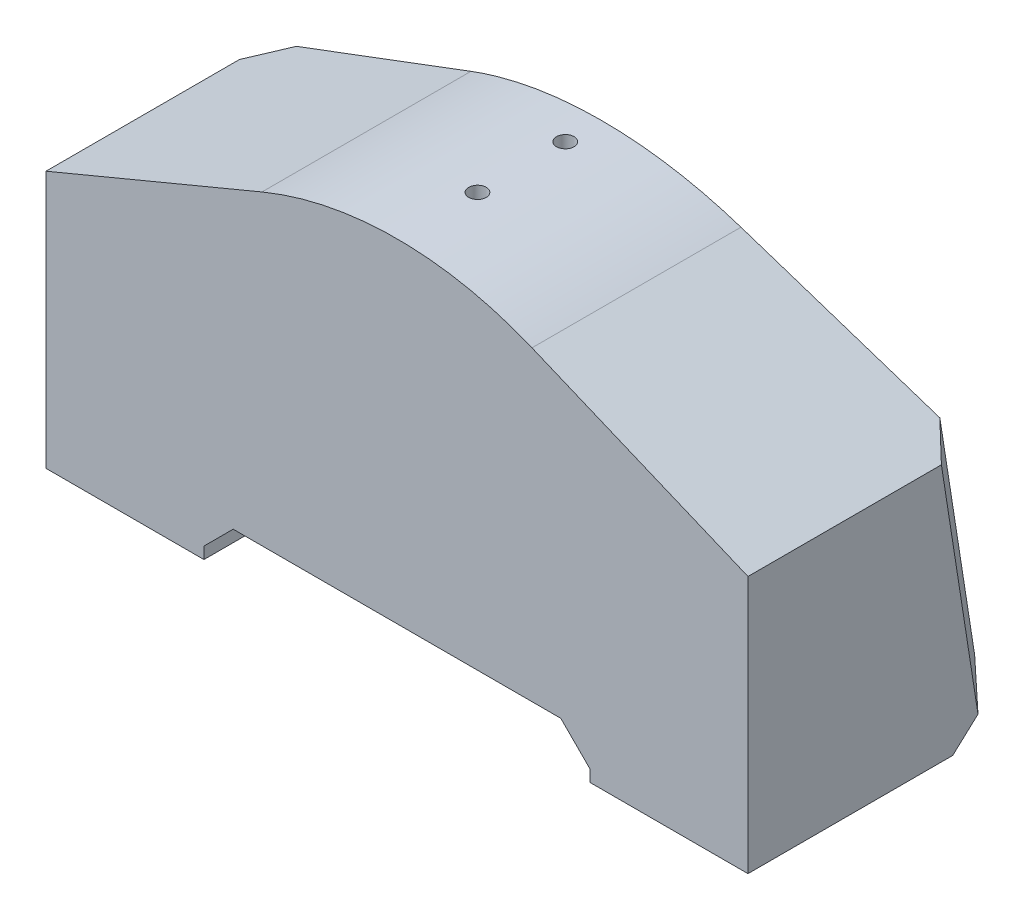
ISO-10303-21;
HEADER;
FILE_DESCRIPTION(('STEP AP214'),'2;1');
FILE_NAME('part.step','',(''),(''),'','','');
FILE_SCHEMA(('AUTOMOTIVE_DESIGN { 1 0 10303 214 1 1 1 1 }'));
ENDSEC;
DATA;
#1=APPLICATION_CONTEXT('core data for automotive mechanical design processes');
#2=APPLICATION_PROTOCOL_DEFINITION('international standard','automotive_design',2000,#1);
#3=PRODUCT_CONTEXT('',#1,'mechanical');
#4=PRODUCT('Part','Part','',(#3));
#5=PRODUCT_RELATED_PRODUCT_CATEGORY('part','',(#4));
#6=PRODUCT_DEFINITION_FORMATION('','',#4);
#7=PRODUCT_DEFINITION_CONTEXT('part definition',#1,'design');
#8=PRODUCT_DEFINITION('design','',#6,#7);
#9=PRODUCT_DEFINITION_SHAPE('','',#8);
#10=(LENGTH_UNIT() NAMED_UNIT(*) SI_UNIT(.MILLI.,.METRE.));
#11=(NAMED_UNIT(*) PLANE_ANGLE_UNIT() SI_UNIT($,.RADIAN.));
#12=(NAMED_UNIT(*) SI_UNIT($,.STERADIAN.) SOLID_ANGLE_UNIT());
#13=UNCERTAINTY_MEASURE_WITH_UNIT(LENGTH_MEASURE(1.E-05),#10,'distance_accuracy_value','');
#14=(GEOMETRIC_REPRESENTATION_CONTEXT(3) GLOBAL_UNCERTAINTY_ASSIGNED_CONTEXT((#13)) GLOBAL_UNIT_ASSIGNED_CONTEXT((#10,
#11,#12)) REPRESENTATION_CONTEXT('',''));
#15=CARTESIAN_POINT('',(0.,0.,0.));
#16=DIRECTION('',(0.,0.,1.));
#17=DIRECTION('',(1.,0.,0.));
#18=AXIS2_PLACEMENT_3D('',#15,#16,#17);
#19=CARTESIAN_POINT('',(0.,-14.,0.));
#20=DIRECTION('',(0.,-1.,0.));
#21=DIRECTION('',(0.,0.,-1.));
#22=AXIS2_PLACEMENT_3D('',#19,#20,#21);
#23=PLANE('',#22);
#24=CARTESIAN_POINT('',(-50.,-14.,-7.5));
#25=DIRECTION('',(0.,-1.,0.));
#26=DIRECTION('',(0.,0.,-1.));
#27=AXIS2_PLACEMENT_3D('',#24,#25,#26);
#28=CIRCLE('',#27,1.55);
#29=CARTESIAN_POINT('',(-50.,-14.,-9.05));
#30=VERTEX_POINT('',#29);
#31=EDGE_CURVE('E317',#30,#30,#28,.T.);
#32=ORIENTED_EDGE('',*,*,#31,.F.);
#33=EDGE_LOOP('',(#32));
#34=FACE_BOUND('',#33,.T.);
#35=DIRECTION('',(0.,0.,1.));
#36=VECTOR('',#35,1.);
#37=CARTESIAN_POINT('',(-60.,-14.,22.5));
#38=LINE('',#37,#36);
#39=CARTESIAN_POINT('',(-60.,-14.,-12.5));
#40=VERTEX_POINT('',#39);
#41=CARTESIAN_POINT('',(-60.,-14.,22.5));
#42=VERTEX_POINT('',#41);
#43=EDGE_CURVE('E175',#40,#42,#38,.T.);
#44=ORIENTED_EDGE('',*,*,#43,.F.);
#45=DIRECTION('',(-1.,0.,0.));
#46=VECTOR('',#45,1.);
#47=CARTESIAN_POINT('',(60.,-14.,-12.5));
#48=LINE('',#47,#46);
#49=CARTESIAN_POINT('',(-33.,-14.,-12.5));
#50=VERTEX_POINT('',#49);
#51=EDGE_CURVE('E169',#50,#40,#48,.T.);
#52=ORIENTED_EDGE('',*,*,#51,.F.);
#53=DIRECTION('',(0.,0.,1.));
#54=VECTOR('',#53,1.);
#55=CARTESIAN_POINT('',(-33.,-14.,-22.5));
#56=LINE('',#55,#54);
#57=CARTESIAN_POINT('',(-33.,-14.,22.5));
#58=VERTEX_POINT('',#57);
#59=EDGE_CURVE('E357',#50,#58,#56,.T.);
#60=ORIENTED_EDGE('',*,*,#59,.T.);
#61=DIRECTION('',(1.,0.,0.));
#62=VECTOR('',#61,1.);
#63=CARTESIAN_POINT('',(-60.,-14.,22.5));
#64=LINE('',#63,#62);
#65=EDGE_CURVE('E184',#42,#58,#64,.T.);
#66=ORIENTED_EDGE('',*,*,#65,.F.);
#67=EDGE_LOOP('',(#44,#52,#60,#66));
#68=FACE_BOUND('',#67,.T.);
#69=ADVANCED_FACE('F36',(#34,#68),#23,.T.);
#70=CARTESIAN_POINT('',(60.,3.09818876341525,-19.8284079932371));
#71=DIRECTION('',(0.,-0.154376880977534,0.988012033641113));
#72=DIRECTION('',(0.,-0.988012033641113,-0.154376880977534));
#73=AXIS2_PLACEMENT_3D('',#70,#71,#72);
#74=PLANE('',#73);
#75=DIRECTION('',(-1.,0.,0.));
#76=VECTOR('',#75,1.);
#77=CARTESIAN_POINT('',(60.,-6.,-21.2499999941611));
#78=LINE('',#77,#76);
#79=CARTESIAN_POINT('',(55.,-6.,-21.2499999941611));
#80=VERTEX_POINT('',#79);
#81=CARTESIAN_POINT('',(-55.,-6.,-21.2499999941611));
#82=VERTEX_POINT('',#81);
#83=EDGE_CURVE('E159',#80,#82,#78,.T.);
#84=ORIENTED_EDGE('',*,*,#83,.T.);
#85=DIRECTION('',(0.,0.988012033641113,0.154376880977534));
#86=VECTOR('',#85,1.);
#87=CARTESIAN_POINT('',(-55.,3.09818876341525,-19.8284079932371));
#88=LINE('',#87,#86);
#89=CARTESIAN_POINT('',(-55.,32.0833332894768,-15.2994791398849));
#90=VERTEX_POINT('',#89);
#91=EDGE_CURVE('E203',#82,#90,#88,.T.);
#92=ORIENTED_EDGE('',*,*,#91,.T.);
#93=DIRECTION('',(0.921414559252609,0.383922724939917,0.0599879260520718));
#94=VECTOR('',#93,1.);
#95=CARTESIAN_POINT('',(-60.3800070223258,29.8416637440307,-15.6497400079969));
#96=LINE('',#95,#94);
#97=CARTESIAN_POINT('',(-23.076922961942,45.3846151086608,-13.2211538459293));
#98=VERTEX_POINT('',#97);
#99=EDGE_CURVE('E314',#90,#98,#96,.T.);
#100=ORIENTED_EDGE('',*,*,#99,.T.);
#101=CARTESIAN_POINT('',(0.,-10.,-21.8749999970806));
#102=DIRECTION('',(0.,-0.154376880977534,0.988012033641113));
#103=DIRECTION('',(0.,0.988012033641113,0.154376880977534));
#104=AXIS2_PLACEMENT_3D('',#101,#102,#103);
#105=ELLIPSE('',#104,60.7280049818135,59.9999997010492);
#106=CARTESIAN_POINT('',(23.076922961942,45.3846151086608,-13.2211538459293));
#107=VERTEX_POINT('',#106);
#108=EDGE_CURVE('E319',#98,#107,#105,.F.);
#109=ORIENTED_EDGE('',*,*,#108,.T.);
#110=DIRECTION('',(0.921414559252609,-0.383922724939917,-0.0599879260520719));
#111=VECTOR('',#110,1.);
#112=CARTESIAN_POINT('',(60.3800070223258,29.8416637440307,-15.6497400079969));
#113=LINE('',#112,#111);
#114=CARTESIAN_POINT('',(55.,32.0833332894768,-15.2994791398849));
#115=VERTEX_POINT('',#114);
#116=EDGE_CURVE('E196',#107,#115,#113,.T.);
#117=ORIENTED_EDGE('',*,*,#116,.T.);
#118=DIRECTION('',(0.,-0.988012033641113,-0.154376880977534));
#119=VECTOR('',#118,1.);
#120=CARTESIAN_POINT('',(55.,3.09818876341525,-19.8284079932371));
#121=LINE('',#120,#119);
#122=EDGE_CURVE('E205',#115,#80,#121,.T.);
#123=ORIENTED_EDGE('',*,*,#122,.T.);
#124=EDGE_LOOP('',(#84,#92,#100,#109,#117,#123));
#125=FACE_BOUND('',#124,.T.);
#126=ADVANCED_FACE('F259',(#125),#74,.F.);
#127=CARTESIAN_POINT('',(60.,30.,22.5));
#128=DIRECTION('',(-1.,0.,0.));
#129=DIRECTION('',(0.,0.,1.));
#130=AXIS2_PLACEMENT_3D('',#127,#128,#129);
#131=PLANE('',#130);
#132=DIRECTION('',(0.,-0.674769199790194,0.738028811778037));
#133=VECTOR('',#132,1.);
#134=CARTESIAN_POINT('',(60.,-6.,-21.2499999941611));
#135=LINE('',#134,#133);
#136=CARTESIAN_POINT('',(60.,-10.0485336856261,-16.8219162784624));
#137=VERTEX_POINT('',#136);
#138=CARTESIAN_POINT('',(60.,-14.,-12.5));
#139=VERTEX_POINT('',#138);
#140=EDGE_CURVE('E149',#137,#139,#135,.T.);
#141=ORIENTED_EDGE('',*,*,#140,.F.);
#142=DIRECTION('',(0.,0.988012033641113,0.154376880977534));
#143=VECTOR('',#142,1.);
#144=CARTESIAN_POINT('',(60.,35.0431775798572,-9.77633636032003));
#145=LINE('',#144,#143);
#146=CARTESIAN_POINT('',(60.,30.,-10.5643328608535));
#147=VERTEX_POINT('',#146);
#148=EDGE_CURVE('E199',#137,#147,#145,.T.);
#149=ORIENTED_EDGE('',*,*,#148,.T.);
#150=DIRECTION('',(0.,0.,-1.));
#151=VECTOR('',#150,1.);
#152=CARTESIAN_POINT('',(60.,30.,22.5));
#153=LINE('',#152,#151);
#154=CARTESIAN_POINT('',(60.,30.,22.5));
#155=VERTEX_POINT('',#154);
#156=EDGE_CURVE('E187',#155,#147,#153,.T.);
#157=ORIENTED_EDGE('',*,*,#156,.F.);
#158=DIRECTION('',(0.,-1.,0.));
#159=VECTOR('',#158,1.);
#160=CARTESIAN_POINT('',(60.,30.,22.5));
#161=LINE('',#160,#159);
#162=CARTESIAN_POINT('',(60.,-14.,22.5));
#163=VERTEX_POINT('',#162);
#164=EDGE_CURVE('E174',#155,#163,#161,.T.);
#165=ORIENTED_EDGE('',*,*,#164,.T.);
#166=DIRECTION('',(0.,0.,-1.));
#167=VECTOR('',#166,1.);
#168=CARTESIAN_POINT('',(60.,-14.,22.5));
#169=LINE('',#168,#167);
#170=EDGE_CURVE('E167',#163,#139,#169,.T.);
#171=ORIENTED_EDGE('',*,*,#170,.T.);
#172=EDGE_LOOP('',(#141,#149,#157,#165,#171));
#173=FACE_BOUND('',#172,.T.);
#174=ADVANCED_FACE('F172',(#173),#131,.F.);
#175=CARTESIAN_POINT('',(-60.,30.,22.5));
#176=DIRECTION('',(1.,0.,0.));
#177=DIRECTION('',(0.,0.,-1.));
#178=AXIS2_PLACEMENT_3D('',#175,#176,#177);
#179=PLANE('',#178);
#180=DIRECTION('',(0.,-0.674769199790194,0.738028811778037));
#181=VECTOR('',#180,1.);
#182=CARTESIAN_POINT('',(-60.,-6.,-21.2499999941611));
#183=LINE('',#182,#181);
#184=CARTESIAN_POINT('',(-60.,-10.0485336856261,-16.8219162784624));
#185=VERTEX_POINT('',#184);
#186=EDGE_CURVE('E160',#185,#40,#183,.T.);
#187=ORIENTED_EDGE('',*,*,#186,.T.);
#188=ORIENTED_EDGE('',*,*,#43,.T.);
#189=DIRECTION('',(0.,-1.,0.));
#190=VECTOR('',#189,1.);
#191=CARTESIAN_POINT('',(-60.,30.,22.5));
#192=LINE('',#191,#190);
#193=CARTESIAN_POINT('',(-60.,30.,22.5));
#194=VERTEX_POINT('',#193);
#195=EDGE_CURVE('E193',#194,#42,#192,.T.);
#196=ORIENTED_EDGE('',*,*,#195,.F.);
#197=DIRECTION('',(0.,0.,1.));
#198=VECTOR('',#197,1.);
#199=CARTESIAN_POINT('',(-60.,30.,22.5));
#200=LINE('',#199,#198);
#201=CARTESIAN_POINT('',(-60.,30.,-10.5643328608535));
#202=VERTEX_POINT('',#201);
#203=EDGE_CURVE('E190',#202,#194,#200,.T.);
#204=ORIENTED_EDGE('',*,*,#203,.F.);
#205=DIRECTION('',(0.,-0.988012033641113,-0.154376880977534));
#206=VECTOR('',#205,1.);
#207=CARTESIAN_POINT('',(-60.,35.0431775798572,-9.77633636032003));
#208=LINE('',#207,#206);
#209=EDGE_CURVE('E210',#202,#185,#208,.T.);
#210=ORIENTED_EDGE('',*,*,#209,.T.);
#211=EDGE_LOOP('',(#187,#188,#196,#204,#210));
#212=FACE_BOUND('',#211,.T.);
#213=ADVANCED_FACE('F299',(#212),#179,.F.);
#214=CARTESIAN_POINT('',(50.,-14.,-7.5));
#215=DIRECTION('',(0.,-1.,0.));
#216=DIRECTION('',(0.,0.,-1.));
#217=AXIS2_PLACEMENT_3D('',#214,#215,#216);
#218=CIRCLE('',#217,1.55);
#219=CARTESIAN_POINT('',(50.,-14.,-9.05));
#220=VERTEX_POINT('',#219);
#221=EDGE_CURVE('E311',#220,#220,#218,.T.);
#222=ORIENTED_EDGE('',*,*,#221,.F.);
#223=EDGE_LOOP('',(#222));
#224=FACE_BOUND('',#223,.T.);
#225=DIRECTION('',(0.,0.,1.));
#226=VECTOR('',#225,1.);
#227=CARTESIAN_POINT('',(33.,-14.,-22.5));
#228=LINE('',#227,#226);
#229=CARTESIAN_POINT('',(33.,-14.,-12.5));
#230=VERTEX_POINT('',#229);
#231=CARTESIAN_POINT('',(33.,-14.,22.5));
#232=VERTEX_POINT('',#231);
#233=EDGE_CURVE('E168',#230,#232,#228,.T.);
#234=ORIENTED_EDGE('',*,*,#233,.F.);
#235=EDGE_CURVE('E152',#139,#230,#48,.T.);
#236=ORIENTED_EDGE('',*,*,#235,.F.);
#237=ORIENTED_EDGE('',*,*,#170,.F.);
#238=EDGE_CURVE('E178',#232,#163,#64,.T.);
#239=ORIENTED_EDGE('',*,*,#238,.F.);
#240=EDGE_LOOP('',(#234,#236,#237,#239));
#241=FACE_BOUND('',#240,.T.);
#242=ADVANCED_FACE('F165',(#224,#241),#23,.T.);
#243=CARTESIAN_POINT('',(60.,35.0431775798572,-9.77633636032003));
#244=DIRECTION('',(-0.707106781186546,-0.109160939397643,0.698630008881544));
#245=DIRECTION('',(0.,0.988012033641113,0.154376880977534));
#246=AXIS2_PLACEMENT_3D('',#243,#244,#245);
#247=PLANE('',#246);
#248=ORIENTED_EDGE('',*,*,#148,.F.);
#249=DIRECTION('',(0.64019200646645,-0.518367780689595,0.566964759750908));
#250=VECTOR('',#249,1.);
#251=CARTESIAN_POINT('',(47.5934023585105,-0.00282799051019855,-27.8094068751635));
#252=LINE('',#251,#250);
#253=EDGE_CURVE('E155',#137,#80,#252,.F.);
#254=ORIENTED_EDGE('',*,*,#253,.T.);
#255=ORIENTED_EDGE('',*,*,#122,.F.);
#256=DIRECTION('',(0.694968228270403,-0.289570089016893,0.658155244027916));
#257=VECTOR('',#256,1.);
#258=CARTESIAN_POINT('',(54.5406618500906,32.2747241812434,-15.734485806157));
#259=LINE('',#258,#257);
#260=EDGE_CURVE('E201',#147,#115,#259,.F.);
#261=ORIENTED_EDGE('',*,*,#260,.F.);
#262=EDGE_LOOP('',(#248,#254,#255,#261));
#263=FACE_BOUND('',#262,.T.);
#264=ADVANCED_FACE('F298',(#263),#247,.F.);
#265=CARTESIAN_POINT('',(-55.,3.09818876341525,-19.8284079932371));
#266=DIRECTION('',(0.707106781186549,-0.109160939397643,0.698630008881541));
#267=DIRECTION('',(0.,0.988012033641113,0.154376880977534));
#268=AXIS2_PLACEMENT_3D('',#265,#266,#267);
#269=PLANE('',#268);
#270=ORIENTED_EDGE('',*,*,#91,.F.);
#271=DIRECTION('',(0.640192006466447,0.518367780689597,-0.56696475975091));
#272=VECTOR('',#271,1.);
#273=CARTESIAN_POINT('',(-52.4967113891635,-3.97307034683681,-23.466954300829));
#274=LINE('',#273,#272);
#275=EDGE_CURVE('E352',#82,#185,#274,.F.);
#276=ORIENTED_EDGE('',*,*,#275,.T.);
#277=ORIENTED_EDGE('',*,*,#209,.F.);
#278=DIRECTION('',(0.6949682282704,0.289570089016892,-0.658155244027919));
#279=VECTOR('',#278,1.);
#280=CARTESIAN_POINT('',(-54.5406618500906,32.2747241812434,-15.734485806157));
#281=LINE('',#280,#279);
#282=EDGE_CURVE('E208',#90,#202,#281,.F.);
#283=ORIENTED_EDGE('',*,*,#282,.F.);
#284=EDGE_LOOP('',(#270,#276,#277,#283));
#285=FACE_BOUND('',#284,.T.);
#286=ADVANCED_FACE('F250',(#285),#269,.F.);
#287=CARTESIAN_POINT('',(-33.,-14.,-22.5));
#288=DIRECTION('',(1.,0.,0.));
#289=DIRECTION('',(0.,0.,-1.));
#290=AXIS2_PLACEMENT_3D('',#287,#288,#289);
#291=PLANE('',#290);
#292=ORIENTED_EDGE('',*,*,#59,.F.);
#293=DIRECTION('',(0.,0.674769199790194,-0.738028811778037));
#294=VECTOR('',#293,1.);
#295=CARTESIAN_POINT('',(-33.,-9.02000889254427,-17.946865270145));
#296=LINE('',#295,#294);
#297=CARTESIAN_POINT('',(-33.,-12.,-14.6874999985402));
#298=VERTEX_POINT('',#297);
#299=EDGE_CURVE('E381',#50,#298,#296,.T.);
#300=ORIENTED_EDGE('',*,*,#299,.T.);
#301=DIRECTION('',(0.,0.,1.));
#302=VECTOR('',#301,1.);
#303=CARTESIAN_POINT('',(-33.,-12.,22.5));
#304=LINE('',#303,#302);
#305=CARTESIAN_POINT('',(-33.,-12.,22.5));
#306=VERTEX_POINT('',#305);
#307=EDGE_CURVE('E65',#298,#306,#304,.T.);
#308=ORIENTED_EDGE('',*,*,#307,.T.);
#309=DIRECTION('',(0.,1.,0.));
#310=VECTOR('',#309,1.);
#311=CARTESIAN_POINT('',(-33.,-14.,22.5));
#312=LINE('',#311,#310);
#313=EDGE_CURVE('E350',#58,#306,#312,.T.);
#314=ORIENTED_EDGE('',*,*,#313,.F.);
#315=EDGE_LOOP('',(#292,#300,#308,#314));
#316=FACE_BOUND('',#315,.T.);
#317=ADVANCED_FACE('F246',(#316),#291,.T.);
#318=CARTESIAN_POINT('',(-33.,-7.,-22.5));
#319=DIRECTION('',(0.,-1.,0.));
#320=DIRECTION('',(0.,0.,-1.));
#321=AXIS2_PLACEMENT_3D('',#318,#319,#320);
#322=PLANE('',#321);
#323=CARTESIAN_POINT('',(0.,-7.,8.75000000583888));
#324=DIRECTION('',(0.,-1.,0.));
#325=DIRECTION('',(0.,0.,-1.));
#326=AXIS2_PLACEMENT_3D('',#323,#324,#325);
#327=CIRCLE('',#326,1.5);
#328=CARTESIAN_POINT('',(0.,-7.,7.25000000583888));
#329=VERTEX_POINT('',#328);
#330=EDGE_CURVE('E391',#329,#329,#327,.T.);
#331=ORIENTED_EDGE('',*,*,#330,.F.);
#332=EDGE_LOOP('',(#331));
#333=FACE_BOUND('',#332,.T.);
#334=CARTESIAN_POINT('',(0.,-7.,-6.24999999416112));
#335=DIRECTION('',(0.,-1.,0.));
#336=DIRECTION('',(0.,0.,-1.));
#337=AXIS2_PLACEMENT_3D('',#334,#335,#336);
#338=CIRCLE('',#337,1.5);
#339=CARTESIAN_POINT('',(0.,-7.,-7.74999999416112));
#340=VERTEX_POINT('',#339);
#341=EDGE_CURVE('E394',#340,#340,#338,.T.);
#342=ORIENTED_EDGE('',*,*,#341,.F.);
#343=EDGE_LOOP('',(#342));
#344=FACE_BOUND('',#343,.T.);
#345=DIRECTION('',(0.,0.,-1.));
#346=VECTOR('',#345,1.);
#347=CARTESIAN_POINT('',(-28.,-7.,-21.406249994891));
#348=LINE('',#347,#346);
#349=CARTESIAN_POINT('',(-28.,-7.,22.5));
#350=VERTEX_POINT('',#349);
#351=CARTESIAN_POINT('',(-28.,-7.,-20.156249994891));
#352=VERTEX_POINT('',#351);
#353=EDGE_CURVE('E213',#350,#352,#348,.T.);
#354=ORIENTED_EDGE('',*,*,#353,.T.);
#355=DIRECTION('',(1.,0.,0.));
#356=VECTOR('',#355,1.);
#357=CARTESIAN_POINT('',(-33.,-7.,-20.156249994891));
#358=LINE('',#357,#356);
#359=CARTESIAN_POINT('',(28.,-7.,-20.156249994891));
#360=VERTEX_POINT('',#359);
#361=EDGE_CURVE('E57',#352,#360,#358,.T.);
#362=ORIENTED_EDGE('',*,*,#361,.T.);
#363=DIRECTION('',(0.,0.,1.));
#364=VECTOR('',#363,1.);
#365=CARTESIAN_POINT('',(28.,-7.,-22.5));
#366=LINE('',#365,#364);
#367=CARTESIAN_POINT('',(28.,-7.,22.5));
#368=VERTEX_POINT('',#367);
#369=EDGE_CURVE('E216',#360,#368,#366,.T.);
#370=ORIENTED_EDGE('',*,*,#369,.T.);
#371=DIRECTION('',(1.,0.,0.));
#372=VECTOR('',#371,1.);
#373=CARTESIAN_POINT('',(-33.,-7.,22.5));
#374=LINE('',#373,#372);
#375=EDGE_CURVE('E348',#350,#368,#374,.T.);
#376=ORIENTED_EDGE('',*,*,#375,.F.);
#377=EDGE_LOOP('',(#354,#362,#370,#376));
#378=FACE_BOUND('',#377,.T.);
#379=ADVANCED_FACE('F249',(#333,#344,#378),#322,.T.);
#380=CARTESIAN_POINT('',(33.,-14.,-22.5));
#381=DIRECTION('',(1.,0.,0.));
#382=DIRECTION('',(0.,0.,-1.));
#383=AXIS2_PLACEMENT_3D('',#380,#381,#382);
#384=PLANE('',#383);
#385=DIRECTION('',(0.,0.674769199790194,-0.738028811778037));
#386=VECTOR('',#385,1.);
#387=CARTESIAN_POINT('',(33.,-9.02000889254427,-17.946865270145));
#388=LINE('',#387,#386);
#389=CARTESIAN_POINT('',(33.,-12.,-14.6874999985403));
#390=VERTEX_POINT('',#389);
#391=EDGE_CURVE('E384',#230,#390,#388,.T.);
#392=ORIENTED_EDGE('',*,*,#391,.F.);
#393=ORIENTED_EDGE('',*,*,#233,.T.);
#394=DIRECTION('',(0.,1.,0.));
#395=VECTOR('',#394,1.);
#396=CARTESIAN_POINT('',(33.,-14.,22.5));
#397=LINE('',#396,#395);
#398=CARTESIAN_POINT('',(33.,-12.,22.5));
#399=VERTEX_POINT('',#398);
#400=EDGE_CURVE('E344',#232,#399,#397,.T.);
#401=ORIENTED_EDGE('',*,*,#400,.T.);
#402=DIRECTION('',(0.,0.,-1.));
#403=VECTOR('',#402,1.);
#404=CARTESIAN_POINT('',(33.,-12.,-22.5));
#405=LINE('',#404,#403);
#406=EDGE_CURVE('E218',#399,#390,#405,.T.);
#407=ORIENTED_EDGE('',*,*,#406,.T.);
#408=EDGE_LOOP('',(#392,#393,#401,#407));
#409=FACE_BOUND('',#408,.T.);
#410=ADVANCED_FACE('F253',(#409),#384,.F.);
#411=CARTESIAN_POINT('',(28.,-7.,-22.5));
#412=DIRECTION('',(0.707106781186543,0.707106781186552,0.));
#413=DIRECTION('',(0.,0.,1.));
#414=AXIS2_PLACEMENT_3D('',#411,#412,#413);
#415=PLANE('',#414);
#416=DIRECTION('',(-0.559341413757068,0.559341413757061,-0.611779670888545));
#417=VECTOR('',#416,1.);
#418=CARTESIAN_POINT('',(27.1979834997611,-6.19798349976119,-21.0334555414418));
#419=LINE('',#418,#417);
#420=EDGE_CURVE('E382',#390,#360,#419,.T.);
#421=ORIENTED_EDGE('',*,*,#420,.F.);
#422=ORIENTED_EDGE('',*,*,#406,.F.);
#423=DIRECTION('',(0.707106781186552,-0.707106781186543,0.));
#424=VECTOR('',#423,1.);
#425=CARTESIAN_POINT('',(-34.5000000000005,55.4999999999998,22.5));
#426=LINE('',#425,#424);
#427=EDGE_CURVE('E222',#368,#399,#426,.T.);
#428=ORIENTED_EDGE('',*,*,#427,.F.);
#429=ORIENTED_EDGE('',*,*,#369,.F.);
#430=EDGE_LOOP('',(#421,#422,#428,#429));
#431=FACE_BOUND('',#430,.T.);
#432=ADVANCED_FACE('F257',(#431),#415,.F.);
#433=CARTESIAN_POINT('',(-33.,-12.,-22.5));
#434=DIRECTION('',(0.70710678118655,-0.707106781186545,0.));
#435=DIRECTION('',(0.,0.,-1.));
#436=AXIS2_PLACEMENT_3D('',#433,#434,#435);
#437=PLANE('',#436);
#438=DIRECTION('',(0.559341413757061,0.559341413757065,-0.611779670888548));
#439=VECTOR('',#438,1.);
#440=CARTESIAN_POINT('',(-30.3266116711987,-9.32661167119871,-17.6115184812155));
#441=LINE('',#440,#439);
#442=EDGE_CURVE('E226',#352,#298,#441,.F.);
#443=ORIENTED_EDGE('',*,*,#442,.F.);
#444=ORIENTED_EDGE('',*,*,#353,.F.);
#445=DIRECTION('',(-0.707106781186545,-0.70710678118655,0.));
#446=VECTOR('',#445,1.);
#447=CARTESIAN_POINT('',(-25.4999999999999,-4.49999999999985,22.5));
#448=LINE('',#447,#446);
#449=EDGE_CURVE('E224',#306,#350,#448,.F.);
#450=ORIENTED_EDGE('',*,*,#449,.F.);
#451=ORIENTED_EDGE('',*,*,#307,.F.);
#452=EDGE_LOOP('',(#443,#444,#450,#451));
#453=FACE_BOUND('',#452,.T.);
#454=ADVANCED_FACE('F39',(#453),#437,.T.);
#455=CARTESIAN_POINT('',(-60.,30.,22.5));
#456=DIRECTION('',(0.,0.,-1.));
#457=DIRECTION('',(-1.,0.,0.));
#458=AXIS2_PLACEMENT_3D('',#455,#456,#457);
#459=PLANE('',#458);
#460=ORIENTED_EDGE('',*,*,#313,.T.);
#461=ORIENTED_EDGE('',*,*,#449,.T.);
#462=ORIENTED_EDGE('',*,*,#375,.T.);
#463=ORIENTED_EDGE('',*,*,#427,.T.);
#464=ORIENTED_EDGE('',*,*,#400,.F.);
#465=ORIENTED_EDGE('',*,*,#238,.T.);
#466=ORIENTED_EDGE('',*,*,#164,.F.);
#467=DIRECTION('',(-0.92307692595145,0.38461537771652,0.));
#468=VECTOR('',#467,1.);
#469=CARTESIAN_POINT('',(60.,30.,22.5));
#470=LINE('',#469,#468);
#471=CARTESIAN_POINT('',(23.076922961942,45.3846151086608,22.5));
#472=VERTEX_POINT('',#471);
#473=EDGE_CURVE('E323',#155,#472,#470,.T.);
#474=ORIENTED_EDGE('',*,*,#473,.T.);
#475=CARTESIAN_POINT('',(0.,-10.,22.5));
#476=DIRECTION('',(0.,0.,1.));
#477=DIRECTION('',(1.,0.,0.));
#478=AXIS2_PLACEMENT_3D('',#475,#476,#477);
#479=CIRCLE('',#478,59.9999997010492);
#480=CARTESIAN_POINT('',(-23.076922961942,45.3846151086608,22.5));
#481=VERTEX_POINT('',#480);
#482=EDGE_CURVE('E326',#472,#481,#479,.T.);
#483=ORIENTED_EDGE('',*,*,#482,.T.);
#484=DIRECTION('',(-0.92307692595145,-0.38461537771652,0.));
#485=VECTOR('',#484,1.);
#486=CARTESIAN_POINT('',(-60.,30.,22.5));
#487=LINE('',#486,#485);
#488=EDGE_CURVE('E330',#481,#194,#487,.T.);
#489=ORIENTED_EDGE('',*,*,#488,.T.);
#490=ORIENTED_EDGE('',*,*,#195,.T.);
#491=ORIENTED_EDGE('',*,*,#65,.T.);
#492=EDGE_LOOP('',(#460,#461,#462,#463,#464,#465,#466,#474,#483,#489,#490,#491));
#493=FACE_BOUND('',#492,.T.);
#494=ADVANCED_FACE('F280',(#493),#459,.F.);
#495=CARTESIAN_POINT('',(-60.,30.,-22.5));
#496=DIRECTION('',(-0.38461537771652,0.92307692595145,0.));
#497=DIRECTION('',(-0.92307692595145,-0.38461537771652,0.));
#498=AXIS2_PLACEMENT_3D('',#495,#496,#497);
#499=PLANE('',#498);
#500=ORIENTED_EDGE('',*,*,#99,.F.);
#501=ORIENTED_EDGE('',*,*,#282,.T.);
#502=ORIENTED_EDGE('',*,*,#203,.T.);
#503=ORIENTED_EDGE('',*,*,#488,.F.);
#504=DIRECTION('',(0.,0.,1.));
#505=VECTOR('',#504,1.);
#506=CARTESIAN_POINT('',(-23.076922961942,45.3846151086608,-22.5));
#507=LINE('',#506,#505);
#508=EDGE_CURVE('E176',#98,#481,#507,.T.);
#509=ORIENTED_EDGE('',*,*,#508,.F.);
#510=EDGE_LOOP('',(#500,#501,#502,#503,#509));
#511=FACE_BOUND('',#510,.T.);
#512=ADVANCED_FACE('F278',(#511),#499,.T.);
#513=CARTESIAN_POINT('',(0.,-10.,-22.5));
#514=DIRECTION('',(0.,0.,1.));
#515=DIRECTION('',(1.,0.,0.));
#516=AXIS2_PLACEMENT_3D('',#513,#514,#515);
#517=CYLINDRICAL_SURFACE('',#516,59.9999997010492);
#518=CARTESIAN_POINT('',(0.,49.9999997010492,7.25000000583888));
#519=CARTESIAN_POINT('',(-0.0842415367262805,49.9999994481412,7.250003737277));
#520=CARTESIAN_POINT('',(-0.16854382142579,49.9998203813438,7.25712046046117));
#521=CARTESIAN_POINT('',(-0.334825693430629,49.9991232626913,7.28541118113948));
#522=CARTESIAN_POINT('',(-0.416802377081253,49.9986048049794,7.30660200943609));
#523=CARTESIAN_POINT('',(-0.576000039563766,49.9972876241609,7.36243644010686));
#524=CARTESIAN_POINT('',(-0.653223307006597,49.9964890371877,7.39707350893325));
#525=CARTESIAN_POINT('',(-0.800737429747401,49.9947017006155,7.47880795057789));
#526=CARTESIAN_POINT('',(-0.871029981152566,49.993712997718,7.52590226437739));
#527=CARTESIAN_POINT('',(-1.00273441419362,49.9916563749663,7.63123475703892));
#528=CARTESIAN_POINT('',(-1.06414362751821,49.9905884314556,7.68947627206145));
#529=CARTESIAN_POINT('',(-1.17631590618773,49.9884939020537,7.81544452368349));
#530=CARTESIAN_POINT('',(-1.2270785493528,49.9874673178037,7.88317163624802));
#531=CARTESIAN_POINT('',(-1.31651928480759,49.9855711806999,8.02619640726992));
#532=CARTESIAN_POINT('',(-1.3551960183456,49.9847016455068,8.10149491568034));
#533=CARTESIAN_POINT('',(-1.4193580979663,49.9832178411935,8.25751891919385));
#534=CARTESIAN_POINT('',(-1.44484348889001,49.9826035712055,8.33824439584812));
#535=CARTESIAN_POINT('',(-1.48189437645731,49.9816997109359,8.50281292647241));
#536=CARTESIAN_POINT('',(-1.49346279448278,49.9814100525143,8.58665532234346));
#537=CARTESIAN_POINT('',(-1.50236034103242,49.9811878697366,8.75509254649884));
#538=CARTESIAN_POINT('',(-1.49968951686717,49.981255344194,8.83968737228226));
#539=CARTESIAN_POINT('',(-1.48018689103235,49.9817397547037,9.007208292279));
#540=CARTESIAN_POINT('',(-1.4633582540902,49.9821566126574,9.09013475518385));
#541=CARTESIAN_POINT('',(-1.4160225963685,49.9832926735081,9.25198515176528));
#542=CARTESIAN_POINT('',(-1.38551555025919,49.984011876965,9.33090907802964));
#543=CARTESIAN_POINT('',(-1.31168543035597,49.9856716408815,9.48252417148785));
#544=CARTESIAN_POINT('',(-1.26836090517529,49.9866122264068,9.5552146316324));
#545=CARTESIAN_POINT('',(-1.17012674879256,49.9886086922151,9.69229159217923));
#546=CARTESIAN_POINT('',(-1.11521710063781,49.9896645726669,9.75667808042996));
#547=CARTESIAN_POINT('',(-0.995353470256377,49.9917729431606,9.87533784718259));
#548=CARTESIAN_POINT('',(-0.930396741502915,49.9928254321948,9.92960835134958));
#549=CARTESIAN_POINT('',(-0.792292542288836,49.9948080895088,10.0264742386445));
#550=CARTESIAN_POINT('',(-0.719145070588867,49.99573825777,10.0690696200059));
#551=CARTESIAN_POINT('',(-0.566734271346345,49.9973714228342,10.1413758011912));
#552=CARTESIAN_POINT('',(-0.487470903265173,49.9980744181312,10.1710865156018));
#553=CARTESIAN_POINT('',(-0.325079022061431,49.999173963335,10.2167782122377));
#554=CARTESIAN_POINT('',(-0.241950516298045,49.9995705138252,10.2327592206031));
#555=CARTESIAN_POINT('',(-0.0742122049771265,50.0000123922781,10.2505344632081));
#556=CARTESIAN_POINT('',(0.0103971935861334,50.0000578152682,10.2523325358458));
#557=CARTESIAN_POINT('',(0.178716683284471,49.999792569827,10.2417008660224));
#558=CARTESIAN_POINT('',(0.262426775130547,49.9994819016774,10.2292711348108));
#559=CARTESIAN_POINT('',(0.426560710896676,49.99853955179,10.1905398714699));
#560=CARTESIAN_POINT('',(0.506984965880757,49.9979079103403,10.1642400802704));
#561=CARTESIAN_POINT('',(0.662276864644244,49.9963948014008,10.0985170274398));
#562=CARTESIAN_POINT('',(0.737144500884266,49.9955133335721,10.0590937480028));
#563=CARTESIAN_POINT('',(0.879215598581694,49.9935996581326,9.9682329202795));
#564=CARTESIAN_POINT('',(0.946417406677044,49.9925674181123,9.91679278746836));
#565=CARTESIAN_POINT('',(1.07123262428066,49.9904686530802,9.8033622531604));
#566=CARTESIAN_POINT('',(1.12884601560211,49.9894021280032,9.74137183165277));
#567=CARTESIAN_POINT('',(1.23286174528341,49.9873547583188,9.60858397747253));
#568=CARTESIAN_POINT('',(1.27926160696521,49.9863739326698,9.53778460443049));
#569=CARTESIAN_POINT('',(1.35951619803307,49.9846088431988,9.38939854050262));
#570=CARTESIAN_POINT('',(1.39337095110453,49.9838245790057,9.31181186243169));
#571=CARTESIAN_POINT('',(1.44756998170681,49.9825411703936,9.15206294214197));
#572=CARTESIAN_POINT('',(1.46791586668143,49.9820419920526,9.06990124557412));
#573=CARTESIAN_POINT('',(1.49452489098407,49.9813849399587,8.9033267844228));
#574=CARTESIAN_POINT('',(1.50078803114809,49.9812270661854,8.81891401997296));
#575=CARTESIAN_POINT('',(1.49905357564797,49.9812704354832,8.65025849326597));
#576=CARTESIAN_POINT('',(1.49105989329814,49.9814715800083,8.56601569071056));
#577=CARTESIAN_POINT('',(1.46104673446059,49.9822101031213,8.40006816805274));
#578=CARTESIAN_POINT('',(1.43902723003121,49.9827474823791,8.31836345300695));
#579=CARTESIAN_POINT('',(1.3815878572602,49.9840978834667,8.15980950415128));
#580=CARTESIAN_POINT('',(1.34616775381905,49.9849109101324,8.08296035555484));
#581=CARTESIAN_POINT('',(1.26293444570932,49.9867209126808,7.93630142387754));
#582=CARTESIAN_POINT('',(1.21512170094332,49.9877178817369,7.86649137970241));
#583=CARTESIAN_POINT('',(1.10845059898036,49.9897836269544,7.73587543049648));
#584=CARTESIAN_POINT('',(1.04959038689161,49.9908524151551,7.67507104060478));
#585=CARTESIAN_POINT('',(0.922480173780111,49.9929414663655,7.56419066167156));
#586=CARTESIAN_POINT('',(0.854227848674115,49.9939617172803,7.5141173359049));
#587=CARTESIAN_POINT('',(0.71024869433056,49.9958389728112,7.42611449237827));
#588=CARTESIAN_POINT('',(0.634517435898001,49.9966958798004,7.38819222786136));
#589=CARTESIAN_POINT('',(0.477819688093712,49.9981480206291,7.32564444488796));
#590=CARTESIAN_POINT('',(0.396859581975384,49.9987435668553,7.30100304463453));
#591=CARTESIAN_POINT('',(0.262822220313929,49.9994464306532,7.27225806560553));
#592=CARTESIAN_POINT('',(0.210615266428258,49.9996530087978,7.26392176950311));
#593=CARTESIAN_POINT('',(0.105613501985452,49.9999297232674,7.25279157039341));
#594=CARTESIAN_POINT('',(0.0528186915477121,49.9999998596203,7.24999766626048));
#595=CARTESIAN_POINT('',(0.,49.9999997010492,7.25000000583888));
#596=B_SPLINE_CURVE_WITH_KNOTS('',3,(#518,#519,#520,#521,#522,#523,#524,#525,#526,#527,#528,
#529,#530,#531,#532,#533,#534,#535,#536,#537,#538,#539,#540,#541,#542,#543,#544,#545,#546,#547,
#548,#549,#550,#551,#552,#553,#554,#555,#556,#557,#558,#559,#560,#561,#562,#563,#564,#565,#566,
#567,#568,#569,#570,#571,#572,#573,#574,#575,#576,#577,#578,#579,#580,#581,#582,#583,#584,#585,
#586,#587,#588,#589,#590,#591,#592,#593,#594,#595),.UNSPECIFIED.,.T.,.F.,(4,2,2,2,2,2,2,2,2,2,2,
2,2,2,2,2,2,2,2,2,2,2,2,2,2,2,2,2,2,2,2,2,2,2,2,2,2,2,4),(0.,0.252531817239587,
0.505366174823064,0.75807783328666,1.01072749303357,1.26345288493369,1.51618829653074,
1.76895211155246,2.02171506735457,2.2744249551481,2.52713400330132,2.77978657784308,
3.03243962025037,3.28512128277273,3.53780331505101,3.79055454439929,4.04330581199172,
4.29605875506509,4.54881121691916,4.80149527277637,5.05417912884522,5.30683127631186,
5.55948376657804,5.81219064618933,6.06489800511674,6.31766112739155,6.57042377244256,
6.82315633543244,7.07588888341938,7.32855207025039,7.5812157604277,7.83388388353114,
8.08654263122538,8.33924383883861,8.59200769031987,8.84492214238386,9.09753347420928,
9.25586870155807,9.41420389674925),.UNSPECIFIED.);
#597=CARTESIAN_POINT('',(0.,49.9999997010492,7.25000000583888));
#598=VERTEX_POINT('',#597);
#599=EDGE_CURVE('E11',#598,#598,#596,.T.);
#600=ORIENTED_EDGE('',*,*,#599,.F.);
#601=EDGE_LOOP('',(#600));
#602=FACE_BOUND('',#601,.T.);
#603=CARTESIAN_POINT('',(0.,49.9999997010492,-7.74999999416112));
#604=CARTESIAN_POINT('',(-0.0842415367262805,49.9999994481412,-7.749996262723));
#605=CARTESIAN_POINT('',(-0.16854382142579,49.9998203813438,-7.74287953953883));
#606=CARTESIAN_POINT('',(-0.334825693430629,49.9991232626913,-7.71458881886052));
#607=CARTESIAN_POINT('',(-0.416802377081253,49.9986048049794,-7.69339799056391));
#608=CARTESIAN_POINT('',(-0.576000039563766,49.9972876241609,-7.63756355989314));
#609=CARTESIAN_POINT('',(-0.653223307006597,49.9964890371877,-7.60292649106675));
#610=CARTESIAN_POINT('',(-0.800737429747402,49.9947017006155,-7.52119204942211));
#611=CARTESIAN_POINT('',(-0.871029981152567,49.993712997718,-7.47409773562261));
#612=CARTESIAN_POINT('',(-1.00273441419362,49.9916563749663,-7.36876524296108));
#613=CARTESIAN_POINT('',(-1.06414362751821,49.9905884314556,-7.31052372793855));
#614=CARTESIAN_POINT('',(-1.17631590618773,49.9884939020537,-7.18455547631651));
#615=CARTESIAN_POINT('',(-1.2270785493528,49.9874673178037,-7.11682836375197));
#616=CARTESIAN_POINT('',(-1.31651928480759,49.9855711806999,-6.97380359273008));
#617=CARTESIAN_POINT('',(-1.3551960183456,49.9847016455068,-6.89850508431966));
#618=CARTESIAN_POINT('',(-1.41935809796631,49.9832178411935,-6.74248108080615));
#619=CARTESIAN_POINT('',(-1.44484348889001,49.9826035712055,-6.66175560415188));
#620=CARTESIAN_POINT('',(-1.48189437645731,49.9816997109359,-6.49718707352759));
#621=CARTESIAN_POINT('',(-1.49346279448278,49.9814100525143,-6.41334467765654));
#622=CARTESIAN_POINT('',(-1.50236034103242,49.9811878697366,-6.24490745350116));
#623=CARTESIAN_POINT('',(-1.49968951686717,49.981255344194,-6.16031262771774));
#624=CARTESIAN_POINT('',(-1.48018689103235,49.9817397547037,-5.992791707721));
#625=CARTESIAN_POINT('',(-1.4633582540902,49.9821566126574,-5.90986524481616));
#626=CARTESIAN_POINT('',(-1.4160225963685,49.9832926735081,-5.74801484823472));
#627=CARTESIAN_POINT('',(-1.38551555025919,49.984011876965,-5.66909092197036));
#628=CARTESIAN_POINT('',(-1.31168543035597,49.9856716408815,-5.51747582851215));
#629=CARTESIAN_POINT('',(-1.26836090517529,49.9866122264068,-5.4447853683676));
#630=CARTESIAN_POINT('',(-1.17012674879256,49.9886086922151,-5.30770840782077));
#631=CARTESIAN_POINT('',(-1.11521710063781,49.9896645726669,-5.24332191957004));
#632=CARTESIAN_POINT('',(-0.995353470256378,49.9917729431606,-5.12466215281741));
#633=CARTESIAN_POINT('',(-0.930396741502915,49.9928254321948,-5.07039164865042));
#634=CARTESIAN_POINT('',(-0.792292542288836,49.9948080895088,-4.97352576135548));
#635=CARTESIAN_POINT('',(-0.719145070588868,49.99573825777,-4.93093037999413));
#636=CARTESIAN_POINT('',(-0.566734271346346,49.9973714228342,-4.8586241988088));
#637=CARTESIAN_POINT('',(-0.487470903265173,49.9980744181312,-4.82891348439822));
#638=CARTESIAN_POINT('',(-0.325079022061431,49.999173963335,-4.78322178776229));
#639=CARTESIAN_POINT('',(-0.241950516298045,49.9995705138252,-4.76724077939685));
#640=CARTESIAN_POINT('',(-0.074212204977127,50.0000123922781,-4.74946553679185));
#641=CARTESIAN_POINT('',(0.0103971935861328,50.0000578152682,-4.74766746415424));
#642=CARTESIAN_POINT('',(0.178716683284471,49.999792569827,-4.75829913397761));
#643=CARTESIAN_POINT('',(0.262426775130546,49.9994819016774,-4.77072886518916));
#644=CARTESIAN_POINT('',(0.426560710896676,49.99853955179,-4.80946012853011));
#645=CARTESIAN_POINT('',(0.506984965880758,49.9979079103403,-4.83575991972964));
#646=CARTESIAN_POINT('',(0.662276864644244,49.9963948014008,-4.9014829725602));
#647=CARTESIAN_POINT('',(0.737144500884266,49.9955133335721,-4.94090625199718));
#648=CARTESIAN_POINT('',(0.879215598581694,49.9935996581326,-5.0317670797205));
#649=CARTESIAN_POINT('',(0.946417406677044,49.9925674181123,-5.08320721253164));
#650=CARTESIAN_POINT('',(1.07123262428066,49.9904686530802,-5.1966377468396));
#651=CARTESIAN_POINT('',(1.12884601560211,49.9894021280032,-5.25862816834723));
#652=CARTESIAN_POINT('',(1.23286174528341,49.9873547583188,-5.39141602252747));
#653=CARTESIAN_POINT('',(1.27926160696521,49.9863739326698,-5.46221539556951));
#654=CARTESIAN_POINT('',(1.35951619803307,49.9846088431988,-5.61060145949738));
#655=CARTESIAN_POINT('',(1.39337095110453,49.9838245790057,-5.68818813756831));
#656=CARTESIAN_POINT('',(1.44756998170681,49.9825411703936,-5.84793705785803));
#657=CARTESIAN_POINT('',(1.46791586668143,49.9820419920526,-5.93009875442588));
#658=CARTESIAN_POINT('',(1.49452489098407,49.9813849399586,-6.0966732155772));
#659=CARTESIAN_POINT('',(1.50078803114809,49.9812270661854,-6.18108598002704));
#660=CARTESIAN_POINT('',(1.49905357564797,49.9812704354832,-6.34974150673403));
#661=CARTESIAN_POINT('',(1.49105989329814,49.9814715800083,-6.43398430928944));
#662=CARTESIAN_POINT('',(1.46104673446059,49.9822101031213,-6.59993183194726));
#663=CARTESIAN_POINT('',(1.43902723003121,49.9827474823791,-6.68163654699305));
#664=CARTESIAN_POINT('',(1.3815878572602,49.9840978834667,-6.84019049584872));
#665=CARTESIAN_POINT('',(1.34616775381905,49.9849109101324,-6.91703964444515));
#666=CARTESIAN_POINT('',(1.26293444570932,49.9867209126808,-7.06369857612246));
#667=CARTESIAN_POINT('',(1.21512170094332,49.9877178817369,-7.13350862029759));
#668=CARTESIAN_POINT('',(1.10845059898036,49.9897836269544,-7.26412456950352));
#669=CARTESIAN_POINT('',(1.04959038689161,49.9908524151551,-7.32492895939522));
#670=CARTESIAN_POINT('',(0.92248017378011,49.9929414663655,-7.43580933832844));
#671=CARTESIAN_POINT('',(0.854227848674114,49.9939617172803,-7.4858826640951));
#672=CARTESIAN_POINT('',(0.710248694330559,49.9958389728112,-7.57388550762173));
#673=CARTESIAN_POINT('',(0.634517435897999,49.9966958798004,-7.61180777213864));
#674=CARTESIAN_POINT('',(0.477819688093711,49.9981480206291,-7.67435555511204));
#675=CARTESIAN_POINT('',(0.396859581975383,49.9987435668553,-7.69899695536547));
#676=CARTESIAN_POINT('',(0.262822220313929,49.9994464306532,-7.72774193439447));
#677=CARTESIAN_POINT('',(0.210615266428258,49.9996530087978,-7.73607823049689));
#678=CARTESIAN_POINT('',(0.105613501985452,49.9999297232674,-7.74720842960659));
#679=CARTESIAN_POINT('',(0.0528186915477121,49.9999998596203,-7.75000233373952));
#680=CARTESIAN_POINT('',(0.,49.9999997010492,-7.74999999416112));
#681=B_SPLINE_CURVE_WITH_KNOTS('',3,(#603,#604,#605,#606,#607,#608,#609,#610,#611,#612,#613,
#614,#615,#616,#617,#618,#619,#620,#621,#622,#623,#624,#625,#626,#627,#628,#629,#630,#631,#632,
#633,#634,#635,#636,#637,#638,#639,#640,#641,#642,#643,#644,#645,#646,#647,#648,#649,#650,#651,
#652,#653,#654,#655,#656,#657,#658,#659,#660,#661,#662,#663,#664,#665,#666,#667,#668,#669,#670,
#671,#672,#673,#674,#675,#676,#677,#678,#679,#680),.UNSPECIFIED.,.T.,.F.,(4,2,2,2,2,2,2,2,2,2,2,
2,2,2,2,2,2,2,2,2,2,2,2,2,2,2,2,2,2,2,2,2,2,2,2,2,2,2,4),(0.,0.252531817239587,
0.505366174823064,0.75807783328666,1.01072749303357,1.26345288493369,1.51618829653074,
1.76895211155246,2.02171506735457,2.2744249551481,2.52713400330132,2.77978657784308,
3.03243962025038,3.28512128277273,3.53780331505101,3.79055454439929,4.04330581199172,
4.2960587550651,4.54881121691916,4.80149527277637,5.05417912884522,5.30683127631186,
5.55948376657804,5.81219064618933,6.06489800511674,6.31766112739155,6.57042377244256,
6.82315633543244,7.07588888341938,7.32855207025039,7.5812157604277,7.83388388353114,
8.08654263122538,8.33924383883861,8.59200769031987,8.84492214238387,9.09753347420928,
9.25586870155807,9.41420389674925),.UNSPECIFIED.);
#682=CARTESIAN_POINT('',(0.,49.9999997010492,-7.74999999416112));
#683=VERTEX_POINT('',#682);
#684=EDGE_CURVE('E50',#683,#683,#681,.T.);
#685=ORIENTED_EDGE('',*,*,#684,.F.);
#686=EDGE_LOOP('',(#685));
#687=FACE_BOUND('',#686,.T.);
#688=DIRECTION('',(0.,0.,1.));
#689=VECTOR('',#688,1.);
#690=CARTESIAN_POINT('',(23.076922961942,45.3846151086608,-22.5));
#691=LINE('',#690,#689);
#692=EDGE_CURVE('E180',#107,#472,#691,.T.);
#693=ORIENTED_EDGE('',*,*,#692,.F.);
#694=ORIENTED_EDGE('',*,*,#108,.F.);
#695=ORIENTED_EDGE('',*,*,#508,.T.);
#696=ORIENTED_EDGE('',*,*,#482,.F.);
#697=EDGE_LOOP('',(#693,#694,#695,#696));
#698=FACE_BOUND('',#697,.T.);
#699=ADVANCED_FACE('F232',(#602,#687,#698),#517,.T.);
#700=CARTESIAN_POINT('',(60.,30.,-22.5));
#701=DIRECTION('',(0.38461537771652,0.92307692595145,0.));
#702=DIRECTION('',(-0.92307692595145,0.38461537771652,0.));
#703=AXIS2_PLACEMENT_3D('',#700,#701,#702);
#704=PLANE('',#703);
#705=ORIENTED_EDGE('',*,*,#156,.T.);
#706=ORIENTED_EDGE('',*,*,#260,.T.);
#707=ORIENTED_EDGE('',*,*,#116,.F.);
#708=ORIENTED_EDGE('',*,*,#692,.T.);
#709=ORIENTED_EDGE('',*,*,#473,.F.);
#710=EDGE_LOOP('',(#705,#706,#707,#708,#709));
#711=FACE_BOUND('',#710,.T.);
#712=ADVANCED_FACE('F276',(#711),#704,.T.);
#713=CARTESIAN_POINT('',(50.,-8.,-7.5));
#714=DIRECTION('',(0.,-1.,0.));
#715=DIRECTION('',(0.,0.,-1.));
#716=AXIS2_PLACEMENT_3D('',#713,#714,#715);
#717=CYLINDRICAL_SURFACE('',#716,1.55);
#718=CARTESIAN_POINT('',(50.,-8.,-7.5));
#719=DIRECTION('',(0.,-1.,0.));
#720=DIRECTION('',(0.,0.,-1.));
#721=AXIS2_PLACEMENT_3D('',#718,#719,#720);
#722=CIRCLE('',#721,1.55);
#723=CARTESIAN_POINT('',(50.,-8.,-9.05));
#724=VERTEX_POINT('',#723);
#725=EDGE_CURVE('E313',#724,#724,#722,.T.);
#726=ORIENTED_EDGE('',*,*,#725,.F.);
#727=EDGE_LOOP('',(#726));
#728=FACE_BOUND('',#727,.T.);
#729=ORIENTED_EDGE('',*,*,#221,.T.);
#730=EDGE_LOOP('',(#729));
#731=FACE_BOUND('',#730,.T.);
#732=ADVANCED_FACE('F273',(#728,#731),#717,.F.);
#733=CARTESIAN_POINT('',(50.,-8.,-7.5));
#734=DIRECTION('',(0.,-1.,0.));
#735=DIRECTION('',(0.,0.,-1.));
#736=AXIS2_PLACEMENT_3D('',#733,#734,#735);
#737=PLANE('',#736);
#738=ORIENTED_EDGE('',*,*,#725,.T.);
#739=EDGE_LOOP('',(#738));
#740=FACE_BOUND('',#739,.T.);
#741=ADVANCED_FACE('F269',(#740),#737,.T.);
#742=CARTESIAN_POINT('',(-50.,-8.,-7.5));
#743=DIRECTION('',(0.,-1.,0.));
#744=DIRECTION('',(0.,0.,-1.));
#745=AXIS2_PLACEMENT_3D('',#742,#743,#744);
#746=CYLINDRICAL_SURFACE('',#745,1.55);
#747=CARTESIAN_POINT('',(-50.,-8.,-7.5));
#748=DIRECTION('',(0.,-1.,0.));
#749=DIRECTION('',(0.,0.,-1.));
#750=AXIS2_PLACEMENT_3D('',#747,#748,#749);
#751=CIRCLE('',#750,1.55);
#752=CARTESIAN_POINT('',(-50.,-8.,-9.05));
#753=VERTEX_POINT('',#752);
#754=EDGE_CURVE('E327',#753,#753,#751,.T.);
#755=ORIENTED_EDGE('',*,*,#754,.F.);
#756=EDGE_LOOP('',(#755));
#757=FACE_BOUND('',#756,.T.);
#758=ORIENTED_EDGE('',*,*,#31,.T.);
#759=EDGE_LOOP('',(#758));
#760=FACE_BOUND('',#759,.T.);
#761=ADVANCED_FACE('F265',(#757,#760),#746,.F.);
#762=CARTESIAN_POINT('',(-50.,-8.,-7.5));
#763=DIRECTION('',(0.,-1.,0.));
#764=DIRECTION('',(0.,0.,-1.));
#765=AXIS2_PLACEMENT_3D('',#762,#763,#764);
#766=PLANE('',#765);
#767=ORIENTED_EDGE('',*,*,#754,.T.);
#768=EDGE_LOOP('',(#767));
#769=FACE_BOUND('',#768,.T.);
#770=ADVANCED_FACE('F245',(#769),#766,.T.);
#771=CARTESIAN_POINT('',(60.,-6.,-21.2499999941611));
#772=DIRECTION('',(0.,-0.738028811778037,-0.674769199790194));
#773=DIRECTION('',(0.,0.674769199790194,-0.738028811778037));
#774=AXIS2_PLACEMENT_3D('',#771,#772,#773);
#775=PLANE('',#774);
#776=ORIENTED_EDGE('',*,*,#140,.T.);
#777=ORIENTED_EDGE('',*,*,#235,.T.);
#778=ORIENTED_EDGE('',*,*,#391,.T.);
#779=ORIENTED_EDGE('',*,*,#420,.T.);
#780=ORIENTED_EDGE('',*,*,#361,.F.);
#781=ORIENTED_EDGE('',*,*,#442,.T.);
#782=ORIENTED_EDGE('',*,*,#299,.F.);
#783=ORIENTED_EDGE('',*,*,#51,.T.);
#784=ORIENTED_EDGE('',*,*,#186,.F.);
#785=ORIENTED_EDGE('',*,*,#275,.F.);
#786=ORIENTED_EDGE('',*,*,#83,.F.);
#787=ORIENTED_EDGE('',*,*,#253,.F.);
#788=EDGE_LOOP('',(#776,#777,#778,#779,#780,#781,#782,#783,#784,#785,#786,#787));
#789=FACE_BOUND('',#788,.T.);
#790=ADVANCED_FACE('F151',(#789),#775,.T.);
#791=CARTESIAN_POINT('',(0.,49.9999997010492,-6.24999999416112));
#792=DIRECTION('',(0.,-1.,0.));
#793=DIRECTION('',(0.,0.,-1.));
#794=AXIS2_PLACEMENT_3D('',#791,#792,#793);
#795=CYLINDRICAL_SURFACE('',#794,1.5);
#796=ORIENTED_EDGE('',*,*,#684,.T.);
#797=EDGE_LOOP('',(#796));
#798=FACE_BOUND('',#797,.T.);
#799=ORIENTED_EDGE('',*,*,#341,.T.);
#800=EDGE_LOOP('',(#799));
#801=FACE_BOUND('',#800,.T.);
#802=ADVANCED_FACE('F236',(#798,#801),#795,.F.);
#803=CARTESIAN_POINT('',(0.,49.9999997010492,8.75000000583888));
#804=DIRECTION('',(0.,-1.,0.));
#805=DIRECTION('',(0.,0.,-1.));
#806=AXIS2_PLACEMENT_3D('',#803,#804,#805);
#807=CYLINDRICAL_SURFACE('',#806,1.5);
#808=ORIENTED_EDGE('',*,*,#599,.T.);
#809=EDGE_LOOP('',(#808));
#810=FACE_BOUND('',#809,.T.);
#811=ORIENTED_EDGE('',*,*,#330,.T.);
#812=EDGE_LOOP('',(#811));
#813=FACE_BOUND('',#812,.T.);
#814=ADVANCED_FACE('F240',(#810,#813),#807,.F.);
#815=CLOSED_SHELL('',(#69,#126,#174,#213,#242,#264,#286,#317,#379,#410,#432,#454,#494,#512,#699,
#712,#732,#741,#761,#770,#790,#802,#814));
#816=MANIFOLD_SOLID_BREP('B2',#815);
#817=ADVANCED_BREP_SHAPE_REPRESENTATION('',(#18,#816),#14);
#818=SHAPE_DEFINITION_REPRESENTATION(#9,#817);
ENDSEC;
END-ISO-10303-21;
